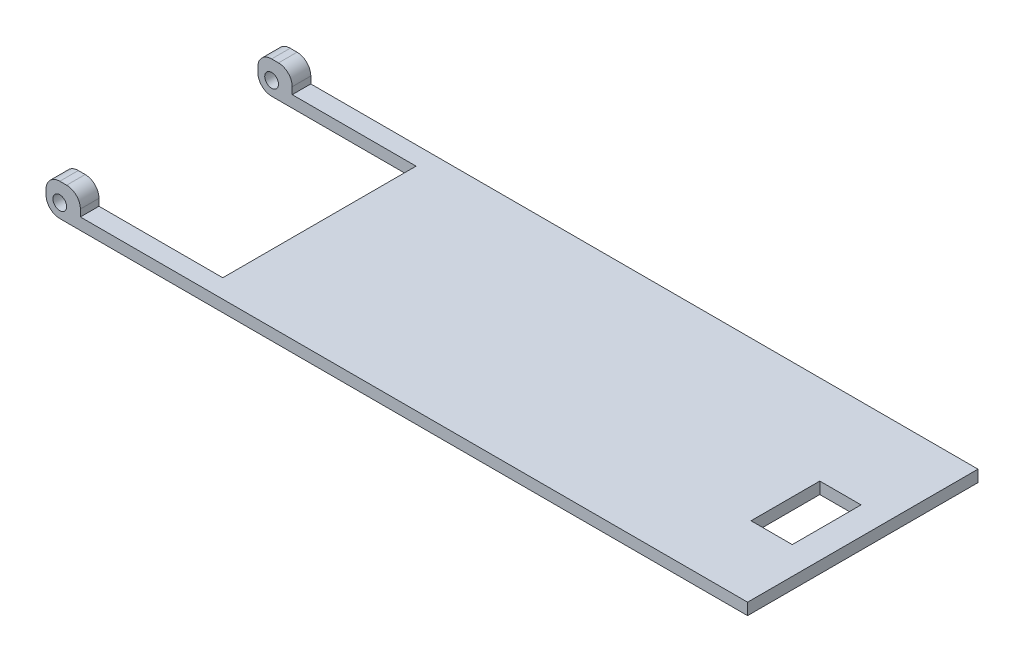
ISO-10303-21;
HEADER;
FILE_DESCRIPTION(('STEP AP214'),'2;1');
FILE_NAME('part.step','',(''),(''),'','','');
FILE_SCHEMA(('AUTOMOTIVE_DESIGN { 1 0 10303 214 1 1 1 1 }'));
ENDSEC;
DATA;
#1=APPLICATION_CONTEXT('core data for automotive mechanical design processes');
#2=APPLICATION_PROTOCOL_DEFINITION('international standard','automotive_design',2000,#1);
#3=PRODUCT_CONTEXT('',#1,'mechanical');
#4=PRODUCT('Part','Part','',(#3));
#5=PRODUCT_RELATED_PRODUCT_CATEGORY('part','',(#4));
#6=PRODUCT_DEFINITION_FORMATION('','',#4);
#7=PRODUCT_DEFINITION_CONTEXT('part definition',#1,'design');
#8=PRODUCT_DEFINITION('design','',#6,#7);
#9=PRODUCT_DEFINITION_SHAPE('','',#8);
#10=(LENGTH_UNIT() NAMED_UNIT(*) SI_UNIT(.MILLI.,.METRE.));
#11=(NAMED_UNIT(*) PLANE_ANGLE_UNIT() SI_UNIT($,.RADIAN.));
#12=(NAMED_UNIT(*) SI_UNIT($,.STERADIAN.) SOLID_ANGLE_UNIT());
#13=UNCERTAINTY_MEASURE_WITH_UNIT(LENGTH_MEASURE(1.E-05),#10,'distance_accuracy_value','');
#14=(GEOMETRIC_REPRESENTATION_CONTEXT(3) GLOBAL_UNCERTAINTY_ASSIGNED_CONTEXT((#13)) GLOBAL_UNIT_ASSIGNED_CONTEXT((#10,
#11,#12)) REPRESENTATION_CONTEXT('',''));
#15=CARTESIAN_POINT('',(0.,0.,0.));
#16=DIRECTION('',(0.,0.,1.));
#17=DIRECTION('',(1.,0.,0.));
#18=AXIS2_PLACEMENT_3D('',#15,#16,#17);
#19=CARTESIAN_POINT('',(0.,1.7,0.));
#20=DIRECTION('',(0.,-1.,0.));
#21=DIRECTION('',(0.,0.,-1.));
#22=AXIS2_PLACEMENT_3D('',#19,#20,#21);
#23=PLANE('',#22);
#24=DIRECTION('',(-1.,0.,0.));
#25=VECTOR('',#24,1.);
#26=CARTESIAN_POINT('',(41.,1.7,-3.75));
#27=LINE('',#26,#25);
#28=CARTESIAN_POINT('',(47.,1.7,-3.75));
#29=VERTEX_POINT('',#28);
#30=CARTESIAN_POINT('',(41.,1.7,-3.75));
#31=VERTEX_POINT('',#30);
#32=EDGE_CURVE('E228',#29,#31,#27,.T.);
#33=ORIENTED_EDGE('',*,*,#32,.F.);
#34=DIRECTION('',(0.,0.,-1.));
#35=VECTOR('',#34,1.);
#36=CARTESIAN_POINT('',(47.,1.7,6.25));
#37=LINE('',#36,#35);
#38=CARTESIAN_POINT('',(47.,1.7,6.25));
#39=VERTEX_POINT('',#38);
#40=EDGE_CURVE('E61',#39,#29,#37,.T.);
#41=ORIENTED_EDGE('',*,*,#40,.F.);
#42=DIRECTION('',(1.,0.,0.));
#43=VECTOR('',#42,1.);
#44=CARTESIAN_POINT('',(41.,1.7,6.25));
#45=LINE('',#44,#43);
#46=CARTESIAN_POINT('',(41.,1.7,6.25));
#47=VERTEX_POINT('',#46);
#48=EDGE_CURVE('E215',#47,#39,#45,.T.);
#49=ORIENTED_EDGE('',*,*,#48,.F.);
#50=DIRECTION('',(0.,0.,1.));
#51=VECTOR('',#50,1.);
#52=CARTESIAN_POINT('',(41.,1.7,6.25));
#53=LINE('',#52,#51);
#54=EDGE_CURVE('E219',#31,#47,#53,.T.);
#55=ORIENTED_EDGE('',*,*,#54,.F.);
#56=EDGE_LOOP('',(#33,#41,#49,#55));
#57=FACE_BOUND('',#56,.T.);
#58=DIRECTION('',(-1.,0.,0.));
#59=VECTOR('',#58,1.);
#60=CARTESIAN_POINT('',(-51.,1.7,-16.75));
#61=LINE('',#60,#59);
#62=CARTESIAN_POINT('',(51.,1.7,-16.75));
#63=VERTEX_POINT('',#62);
#64=CARTESIAN_POINT('',(-46.,1.7,-16.75));
#65=VERTEX_POINT('',#64);
#66=EDGE_CURVE('E336',#63,#65,#61,.T.);
#67=ORIENTED_EDGE('',*,*,#66,.T.);
#68=DIRECTION('',(0.,0.,1.));
#69=VECTOR('',#68,1.);
#70=CARTESIAN_POINT('',(-46.,1.7,-14.05));
#71=LINE('',#70,#69);
#72=CARTESIAN_POINT('',(-46.,1.7,-14.05));
#73=VERTEX_POINT('',#72);
#74=EDGE_CURVE('E247',#65,#73,#71,.T.);
#75=ORIENTED_EDGE('',*,*,#74,.T.);
#76=DIRECTION('',(-1.,0.,0.));
#77=VECTOR('',#76,1.);
#78=CARTESIAN_POINT('',(-51.,1.7,-14.05));
#79=LINE('',#78,#77);
#80=CARTESIAN_POINT('',(-28.,1.7,-14.05));
#81=VERTEX_POINT('',#80);
#82=EDGE_CURVE('E299',#81,#73,#79,.T.);
#83=ORIENTED_EDGE('',*,*,#82,.F.);
#84=DIRECTION('',(0.,0.,-1.));
#85=VECTOR('',#84,1.);
#86=CARTESIAN_POINT('',(-28.,1.7,14.05));
#87=LINE('',#86,#85);
#88=CARTESIAN_POINT('',(-28.,1.7,14.05));
#89=VERTEX_POINT('',#88);
#90=EDGE_CURVE('E310',#89,#81,#87,.T.);
#91=ORIENTED_EDGE('',*,*,#90,.F.);
#92=DIRECTION('',(1.,0.,0.));
#93=VECTOR('',#92,1.);
#94=CARTESIAN_POINT('',(-51.,1.7,14.05));
#95=LINE('',#94,#93);
#96=CARTESIAN_POINT('',(-46.,1.7,14.05));
#97=VERTEX_POINT('',#96);
#98=EDGE_CURVE('E294',#97,#89,#95,.T.);
#99=ORIENTED_EDGE('',*,*,#98,.F.);
#100=DIRECTION('',(0.,0.,-1.));
#101=VECTOR('',#100,1.);
#102=CARTESIAN_POINT('',(-46.,1.7,14.05));
#103=LINE('',#102,#101);
#104=CARTESIAN_POINT('',(-46.,1.7,16.75));
#105=VERTEX_POINT('',#104);
#106=EDGE_CURVE('E273',#105,#97,#103,.T.);
#107=ORIENTED_EDGE('',*,*,#106,.F.);
#108=DIRECTION('',(1.,0.,0.));
#109=VECTOR('',#108,1.);
#110=CARTESIAN_POINT('',(-51.,1.7,16.75));
#111=LINE('',#110,#109);
#112=CARTESIAN_POINT('',(51.,1.7,16.75));
#113=VERTEX_POINT('',#112);
#114=EDGE_CURVE('E341',#105,#113,#111,.T.);
#115=ORIENTED_EDGE('',*,*,#114,.T.);
#116=DIRECTION('',(0.,0.,-1.));
#117=VECTOR('',#116,1.);
#118=CARTESIAN_POINT('',(51.,1.7,16.75));
#119=LINE('',#118,#117);
#120=EDGE_CURVE('E332',#113,#63,#119,.T.);
#121=ORIENTED_EDGE('',*,*,#120,.T.);
#122=EDGE_LOOP('',(#67,#75,#83,#91,#99,#107,#115,#121));
#123=FACE_BOUND('',#122,.T.);
#124=ADVANCED_FACE('F45',(#57,#123),#23,.F.);
#125=CARTESIAN_POINT('',(-51.,1.7,16.75));
#126=DIRECTION('',(1.,0.,0.));
#127=DIRECTION('',(0.,0.,-1.));
#128=AXIS2_PLACEMENT_3D('',#125,#126,#127);
#129=PLANE('',#128);
#130=DIRECTION('',(0.,-1.,0.));
#131=VECTOR('',#130,1.);
#132=CARTESIAN_POINT('',(-51.,1.7,-16.75));
#133=LINE('',#132,#131);
#134=CARTESIAN_POINT('',(-51.,2.7,-16.75));
#135=VERTEX_POINT('',#134);
#136=CARTESIAN_POINT('',(-51.,2.,-16.75));
#137=VERTEX_POINT('',#136);
#138=EDGE_CURVE('E361',#135,#137,#133,.T.);
#139=ORIENTED_EDGE('',*,*,#138,.T.);
#140=DIRECTION('',(0.,0.,1.));
#141=VECTOR('',#140,1.);
#142=CARTESIAN_POINT('',(-51.,2.,-14.05));
#143=LINE('',#142,#141);
#144=CARTESIAN_POINT('',(-51.,2.,-14.05));
#145=VERTEX_POINT('',#144);
#146=EDGE_CURVE('E412',#137,#145,#143,.T.);
#147=ORIENTED_EDGE('',*,*,#146,.T.);
#148=DIRECTION('',(0.,1.,0.));
#149=VECTOR('',#148,1.);
#150=CARTESIAN_POINT('',(-51.,0.,-14.05));
#151=LINE('',#150,#149);
#152=CARTESIAN_POINT('',(-51.,2.7,-14.05));
#153=VERTEX_POINT('',#152);
#154=EDGE_CURVE('E317',#145,#153,#151,.T.);
#155=ORIENTED_EDGE('',*,*,#154,.T.);
#156=DIRECTION('',(0.,0.,-1.));
#157=VECTOR('',#156,1.);
#158=CARTESIAN_POINT('',(-51.,2.7,-16.75));
#159=LINE('',#158,#157);
#160=EDGE_CURVE('E408',#153,#135,#159,.T.);
#161=ORIENTED_EDGE('',*,*,#160,.T.);
#162=EDGE_LOOP('',(#139,#147,#155,#161));
#163=FACE_BOUND('',#162,.T.);
#164=ADVANCED_FACE('F456',(#163),#129,.F.);
#165=CARTESIAN_POINT('',(51.,1.7,16.75));
#166=DIRECTION('',(-1.,0.,0.));
#167=DIRECTION('',(0.,0.,1.));
#168=AXIS2_PLACEMENT_3D('',#165,#166,#167);
#169=PLANE('',#168);
#170=DIRECTION('',(0.,0.,-1.));
#171=VECTOR('',#170,1.);
#172=CARTESIAN_POINT('',(51.,0.,16.75));
#173=LINE('',#172,#171);
#174=CARTESIAN_POINT('',(51.,0.,16.75));
#175=VERTEX_POINT('',#174);
#176=CARTESIAN_POINT('',(51.,0.,-16.75));
#177=VERTEX_POINT('',#176);
#178=EDGE_CURVE('E321',#175,#177,#173,.T.);
#179=ORIENTED_EDGE('',*,*,#178,.T.);
#180=DIRECTION('',(0.,-1.,0.));
#181=VECTOR('',#180,1.);
#182=CARTESIAN_POINT('',(51.,1.7,-16.75));
#183=LINE('',#182,#181);
#184=EDGE_CURVE('E365',#63,#177,#183,.T.);
#185=ORIENTED_EDGE('',*,*,#184,.F.);
#186=ORIENTED_EDGE('',*,*,#120,.F.);
#187=DIRECTION('',(0.,-1.,0.));
#188=VECTOR('',#187,1.);
#189=CARTESIAN_POINT('',(51.,1.7,16.75));
#190=LINE('',#189,#188);
#191=EDGE_CURVE('E344',#113,#175,#190,.T.);
#192=ORIENTED_EDGE('',*,*,#191,.T.);
#193=EDGE_LOOP('',(#179,#185,#186,#192));
#194=FACE_BOUND('',#193,.T.);
#195=ADVANCED_FACE('F512',(#194),#169,.F.);
#196=CARTESIAN_POINT('',(-51.,1.7,-16.75));
#197=DIRECTION('',(0.,0.,1.));
#198=DIRECTION('',(1.,0.,0.));
#199=AXIS2_PLACEMENT_3D('',#196,#197,#198);
#200=PLANE('',#199);
#201=CARTESIAN_POINT('',(-49.,2.,-16.75));
#202=DIRECTION('',(0.,0.,1.));
#203=DIRECTION('',(1.,0.,0.));
#204=AXIS2_PLACEMENT_3D('',#201,#202,#203);
#205=CIRCLE('',#204,0.999999999999998);
#206=CARTESIAN_POINT('',(-50.,2.,-16.75));
#207=VERTEX_POINT('',#206);
#208=EDGE_CURVE('E237',#207,#207,#205,.T.);
#209=ORIENTED_EDGE('',*,*,#208,.T.);
#210=EDGE_LOOP('',(#209));
#211=FACE_BOUND('',#210,.T.);
#212=DIRECTION('',(-1.,0.,0.));
#213=VECTOR('',#212,1.);
#214=CARTESIAN_POINT('',(-51.,0.,-16.75));
#215=LINE('',#214,#213);
#216=CARTESIAN_POINT('',(-49.,0.,-16.75));
#217=VERTEX_POINT('',#216);
#218=EDGE_CURVE('E348',#177,#217,#215,.T.);
#219=ORIENTED_EDGE('',*,*,#218,.T.);
#220=CARTESIAN_POINT('',(-49.,2.,-16.75));
#221=DIRECTION('',(0.,0.,1.));
#222=DIRECTION('',(1.,0.,0.));
#223=AXIS2_PLACEMENT_3D('',#220,#221,#222);
#224=CIRCLE('',#223,2.);
#225=EDGE_CURVE('E434',#217,#137,#224,.F.);
#226=ORIENTED_EDGE('',*,*,#225,.T.);
#227=ORIENTED_EDGE('',*,*,#138,.F.);
#228=CARTESIAN_POINT('',(-49.,2.7,-16.75));
#229=DIRECTION('',(0.,0.,1.));
#230=DIRECTION('',(1.,0.,0.));
#231=AXIS2_PLACEMENT_3D('',#228,#229,#230);
#232=CIRCLE('',#231,2.);
#233=CARTESIAN_POINT('',(-49.,4.7,-16.75));
#234=VERTEX_POINT('',#233);
#235=EDGE_CURVE('E428',#135,#234,#232,.F.);
#236=ORIENTED_EDGE('',*,*,#235,.T.);
#237=DIRECTION('',(1.,0.,0.));
#238=VECTOR('',#237,1.);
#239=CARTESIAN_POINT('',(-51.,4.7,-16.75));
#240=LINE('',#239,#238);
#241=CARTESIAN_POINT('',(-48.,4.7,-16.75));
#242=VERTEX_POINT('',#241);
#243=EDGE_CURVE('E255',#234,#242,#240,.T.);
#244=ORIENTED_EDGE('',*,*,#243,.T.);
#245=CARTESIAN_POINT('',(-48.,2.7,-16.75));
#246=DIRECTION('',(0.,0.,1.));
#247=DIRECTION('',(1.,0.,0.));
#248=AXIS2_PLACEMENT_3D('',#245,#246,#247);
#249=CIRCLE('',#248,2.);
#250=CARTESIAN_POINT('',(-46.,2.7,-16.75));
#251=VERTEX_POINT('',#250);
#252=EDGE_CURVE('E431',#242,#251,#249,.F.);
#253=ORIENTED_EDGE('',*,*,#252,.T.);
#254=DIRECTION('',(0.,-1.,0.));
#255=VECTOR('',#254,1.);
#256=CARTESIAN_POINT('',(-46.,4.7,-16.75));
#257=LINE('',#256,#255);
#258=EDGE_CURVE('E259',#251,#65,#257,.T.);
#259=ORIENTED_EDGE('',*,*,#258,.T.);
#260=ORIENTED_EDGE('',*,*,#66,.F.);
#261=ORIENTED_EDGE('',*,*,#184,.T.);
#262=EDGE_LOOP('',(#219,#226,#227,#236,#244,#253,#259,#260,#261));
#263=FACE_BOUND('',#262,.T.);
#264=ADVANCED_FACE('F459',(#211,#263),#200,.F.);
#265=DIRECTION('',(0.,1.,0.));
#266=VECTOR('',#265,1.);
#267=CARTESIAN_POINT('',(-51.,0.,14.05));
#268=LINE('',#267,#266);
#269=CARTESIAN_POINT('',(-51.,2.,14.05));
#270=VERTEX_POINT('',#269);
#271=CARTESIAN_POINT('',(-51.,2.7,14.05));
#272=VERTEX_POINT('',#271);
#273=EDGE_CURVE('E307',#270,#272,#268,.T.);
#274=ORIENTED_EDGE('',*,*,#273,.F.);
#275=DIRECTION('',(0.,0.,1.));
#276=VECTOR('',#275,1.);
#277=CARTESIAN_POINT('',(-51.,2.,16.75));
#278=LINE('',#277,#276);
#279=CARTESIAN_POINT('',(-51.,2.,16.75));
#280=VERTEX_POINT('',#279);
#281=EDGE_CURVE('E372',#270,#280,#278,.T.);
#282=ORIENTED_EDGE('',*,*,#281,.T.);
#283=DIRECTION('',(0.,-1.,0.));
#284=VECTOR('',#283,1.);
#285=CARTESIAN_POINT('',(-51.,1.7,16.75));
#286=LINE('',#285,#284);
#287=CARTESIAN_POINT('',(-51.,2.7,16.75));
#288=VERTEX_POINT('',#287);
#289=EDGE_CURVE('E357',#288,#280,#286,.T.);
#290=ORIENTED_EDGE('',*,*,#289,.F.);
#291=DIRECTION('',(0.,0.,1.));
#292=VECTOR('',#291,1.);
#293=CARTESIAN_POINT('',(-51.,2.7,14.05));
#294=LINE('',#293,#292);
#295=EDGE_CURVE('E369',#288,#272,#294,.F.);
#296=ORIENTED_EDGE('',*,*,#295,.T.);
#297=EDGE_LOOP('',(#274,#282,#290,#296));
#298=FACE_BOUND('',#297,.T.);
#299=ADVANCED_FACE('F503',(#298),#129,.F.);
#300=CARTESIAN_POINT('',(-51.,1.7,16.75));
#301=DIRECTION('',(0.,0.,-1.));
#302=DIRECTION('',(-1.,0.,0.));
#303=AXIS2_PLACEMENT_3D('',#300,#301,#302);
#304=PLANE('',#303);
#305=CARTESIAN_POINT('',(-49.,2.,16.75));
#306=DIRECTION('',(0.,0.,1.));
#307=DIRECTION('',(1.,0.,0.));
#308=AXIS2_PLACEMENT_3D('',#305,#306,#307);
#309=CIRCLE('',#308,0.999999999999998);
#310=CARTESIAN_POINT('',(-48.,2.,16.75));
#311=VERTEX_POINT('',#310);
#312=EDGE_CURVE('E268',#311,#311,#309,.T.);
#313=ORIENTED_EDGE('',*,*,#312,.F.);
#314=EDGE_LOOP('',(#313));
#315=FACE_BOUND('',#314,.T.);
#316=ORIENTED_EDGE('',*,*,#289,.T.);
#317=CARTESIAN_POINT('',(-49.,2.,16.75));
#318=DIRECTION('',(0.,0.,-1.));
#319=DIRECTION('',(-1.,0.,0.));
#320=AXIS2_PLACEMENT_3D('',#317,#318,#319);
#321=CIRCLE('',#320,2.);
#322=CARTESIAN_POINT('',(-49.,0.,16.75));
#323=VERTEX_POINT('',#322);
#324=EDGE_CURVE('E382',#280,#323,#321,.F.);
#325=ORIENTED_EDGE('',*,*,#324,.T.);
#326=DIRECTION('',(1.,0.,0.));
#327=VECTOR('',#326,1.);
#328=CARTESIAN_POINT('',(-51.,0.,16.75));
#329=LINE('',#328,#327);
#330=EDGE_CURVE('E337',#323,#175,#329,.T.);
#331=ORIENTED_EDGE('',*,*,#330,.T.);
#332=ORIENTED_EDGE('',*,*,#191,.F.);
#333=ORIENTED_EDGE('',*,*,#114,.F.);
#334=DIRECTION('',(0.,-1.,0.));
#335=VECTOR('',#334,1.);
#336=CARTESIAN_POINT('',(-46.,4.7,16.75));
#337=LINE('',#336,#335);
#338=CARTESIAN_POINT('',(-46.,2.7,16.75));
#339=VERTEX_POINT('',#338);
#340=EDGE_CURVE('E291',#339,#105,#337,.T.);
#341=ORIENTED_EDGE('',*,*,#340,.F.);
#342=CARTESIAN_POINT('',(-48.,2.7,16.75));
#343=DIRECTION('',(0.,0.,-1.));
#344=DIRECTION('',(-1.,0.,0.));
#345=AXIS2_PLACEMENT_3D('',#342,#343,#344);
#346=CIRCLE('',#345,2.);
#347=CARTESIAN_POINT('',(-48.,4.7,16.75));
#348=VERTEX_POINT('',#347);
#349=EDGE_CURVE('E379',#339,#348,#346,.F.);
#350=ORIENTED_EDGE('',*,*,#349,.T.);
#351=DIRECTION('',(1.,0.,0.));
#352=VECTOR('',#351,1.);
#353=CARTESIAN_POINT('',(-51.,4.7,16.75));
#354=LINE('',#353,#352);
#355=CARTESIAN_POINT('',(-49.,4.7,16.75));
#356=VERTEX_POINT('',#355);
#357=EDGE_CURVE('E277',#356,#348,#354,.T.);
#358=ORIENTED_EDGE('',*,*,#357,.F.);
#359=CARTESIAN_POINT('',(-49.,2.7,16.75));
#360=DIRECTION('',(0.,0.,-1.));
#361=DIRECTION('',(-1.,0.,0.));
#362=AXIS2_PLACEMENT_3D('',#359,#360,#361);
#363=CIRCLE('',#362,2.);
#364=EDGE_CURVE('E376',#356,#288,#363,.F.);
#365=ORIENTED_EDGE('',*,*,#364,.T.);
#366=EDGE_LOOP('',(#316,#325,#331,#332,#333,#341,#350,#358,#365));
#367=FACE_BOUND('',#366,.T.);
#368=ADVANCED_FACE('F486',(#315,#367),#304,.F.);
#369=CARTESIAN_POINT('',(0.,0.,0.));
#370=DIRECTION('',(0.,-1.,0.));
#371=DIRECTION('',(0.,0.,-1.));
#372=AXIS2_PLACEMENT_3D('',#369,#370,#371);
#373=PLANE('',#372);
#374=DIRECTION('',(0.,0.,-1.));
#375=VECTOR('',#374,1.);
#376=CARTESIAN_POINT('',(47.,0.,6.25));
#377=LINE('',#376,#375);
#378=CARTESIAN_POINT('',(47.,0.,6.25));
#379=VERTEX_POINT('',#378);
#380=CARTESIAN_POINT('',(47.,0.,-3.75));
#381=VERTEX_POINT('',#380);
#382=EDGE_CURVE('E196',#379,#381,#377,.T.);
#383=ORIENTED_EDGE('',*,*,#382,.T.);
#384=DIRECTION('',(-1.,0.,0.));
#385=VECTOR('',#384,1.);
#386=CARTESIAN_POINT('',(41.,0.,-3.75));
#387=LINE('',#386,#385);
#388=CARTESIAN_POINT('',(41.,0.,-3.75));
#389=VERTEX_POINT('',#388);
#390=EDGE_CURVE('E206',#381,#389,#387,.T.);
#391=ORIENTED_EDGE('',*,*,#390,.T.);
#392=DIRECTION('',(0.,0.,1.));
#393=VECTOR('',#392,1.);
#394=CARTESIAN_POINT('',(41.,0.,6.25));
#395=LINE('',#394,#393);
#396=CARTESIAN_POINT('',(41.,0.,6.25));
#397=VERTEX_POINT('',#396);
#398=EDGE_CURVE('E69',#389,#397,#395,.T.);
#399=ORIENTED_EDGE('',*,*,#398,.T.);
#400=DIRECTION('',(1.,0.,0.));
#401=VECTOR('',#400,1.);
#402=CARTESIAN_POINT('',(41.,0.,6.25));
#403=LINE('',#402,#401);
#404=EDGE_CURVE('E203',#397,#379,#403,.T.);
#405=ORIENTED_EDGE('',*,*,#404,.T.);
#406=EDGE_LOOP('',(#383,#391,#399,#405));
#407=FACE_BOUND('',#406,.T.);
#408=DIRECTION('',(-1.,0.,0.));
#409=VECTOR('',#408,1.);
#410=CARTESIAN_POINT('',(-51.,0.,-14.05));
#411=LINE('',#410,#409);
#412=CARTESIAN_POINT('',(-28.,0.,-14.05));
#413=VERTEX_POINT('',#412);
#414=CARTESIAN_POINT('',(-49.,0.,-14.05));
#415=VERTEX_POINT('',#414);
#416=EDGE_CURVE('E303',#413,#415,#411,.T.);
#417=ORIENTED_EDGE('',*,*,#416,.T.);
#418=DIRECTION('',(0.,0.,1.));
#419=VECTOR('',#418,1.);
#420=CARTESIAN_POINT('',(-49.,0.,-16.75));
#421=LINE('',#420,#419);
#422=EDGE_CURVE('E425',#415,#217,#421,.F.);
#423=ORIENTED_EDGE('',*,*,#422,.T.);
#424=ORIENTED_EDGE('',*,*,#218,.F.);
#425=ORIENTED_EDGE('',*,*,#178,.F.);
#426=ORIENTED_EDGE('',*,*,#330,.F.);
#427=DIRECTION('',(0.,0.,1.));
#428=VECTOR('',#427,1.);
#429=CARTESIAN_POINT('',(-49.,0.,14.05));
#430=LINE('',#429,#428);
#431=CARTESIAN_POINT('',(-49.,0.,14.05));
#432=VERTEX_POINT('',#431);
#433=EDGE_CURVE('E385',#323,#432,#430,.F.);
#434=ORIENTED_EDGE('',*,*,#433,.T.);
#435=DIRECTION('',(1.,0.,0.));
#436=VECTOR('',#435,1.);
#437=CARTESIAN_POINT('',(-51.,0.,14.05));
#438=LINE('',#437,#436);
#439=CARTESIAN_POINT('',(-28.,0.,14.05));
#440=VERTEX_POINT('',#439);
#441=EDGE_CURVE('E295',#432,#440,#438,.T.);
#442=ORIENTED_EDGE('',*,*,#441,.T.);
#443=DIRECTION('',(0.,0.,-1.));
#444=VECTOR('',#443,1.);
#445=CARTESIAN_POINT('',(-28.,0.,14.05));
#446=LINE('',#445,#444);
#447=EDGE_CURVE('E298',#440,#413,#446,.T.);
#448=ORIENTED_EDGE('',*,*,#447,.T.);
#449=EDGE_LOOP('',(#417,#423,#424,#425,#426,#434,#442,#448));
#450=FACE_BOUND('',#449,.T.);
#451=ADVANCED_FACE('F211',(#407,#450),#373,.T.);
#452=CARTESIAN_POINT('',(-51.,0.,-14.05));
#453=DIRECTION('',(0.,0.,-1.));
#454=DIRECTION('',(-1.,0.,0.));
#455=AXIS2_PLACEMENT_3D('',#452,#453,#454);
#456=PLANE('',#455);
#457=CARTESIAN_POINT('',(-49.,2.,-14.05));
#458=DIRECTION('',(0.,0.,1.));
#459=DIRECTION('',(1.,0.,0.));
#460=AXIS2_PLACEMENT_3D('',#457,#458,#459);
#461=CIRCLE('',#460,0.999999999999998);
#462=CARTESIAN_POINT('',(-50.,2.,-14.05));
#463=VERTEX_POINT('',#462);
#464=EDGE_CURVE('E243',#463,#463,#461,.T.);
#465=ORIENTED_EDGE('',*,*,#464,.F.);
#466=EDGE_LOOP('',(#465));
#467=FACE_BOUND('',#466,.T.);
#468=ORIENTED_EDGE('',*,*,#154,.F.);
#469=CARTESIAN_POINT('',(-49.,2.,-14.05));
#470=DIRECTION('',(0.,0.,-1.));
#471=DIRECTION('',(-1.,0.,0.));
#472=AXIS2_PLACEMENT_3D('',#469,#470,#471);
#473=CIRCLE('',#472,2.);
#474=EDGE_CURVE('E422',#145,#415,#473,.F.);
#475=ORIENTED_EDGE('',*,*,#474,.T.);
#476=ORIENTED_EDGE('',*,*,#416,.F.);
#477=DIRECTION('',(0.,1.,0.));
#478=VECTOR('',#477,1.);
#479=CARTESIAN_POINT('',(-28.,0.,-14.05));
#480=LINE('',#479,#478);
#481=EDGE_CURVE('E322',#413,#81,#480,.T.);
#482=ORIENTED_EDGE('',*,*,#481,.T.);
#483=ORIENTED_EDGE('',*,*,#82,.T.);
#484=DIRECTION('',(0.,-1.,0.));
#485=VECTOR('',#484,1.);
#486=CARTESIAN_POINT('',(-46.,4.7,-14.05));
#487=LINE('',#486,#485);
#488=CARTESIAN_POINT('',(-46.,2.7,-14.05));
#489=VERTEX_POINT('',#488);
#490=EDGE_CURVE('E265',#489,#73,#487,.T.);
#491=ORIENTED_EDGE('',*,*,#490,.F.);
#492=CARTESIAN_POINT('',(-48.,2.7,-14.05));
#493=DIRECTION('',(0.,0.,-1.));
#494=DIRECTION('',(-1.,0.,0.));
#495=AXIS2_PLACEMENT_3D('',#492,#493,#494);
#496=CIRCLE('',#495,2.);
#497=CARTESIAN_POINT('',(-48.,4.7,-14.05));
#498=VERTEX_POINT('',#497);
#499=EDGE_CURVE('E419',#489,#498,#496,.F.);
#500=ORIENTED_EDGE('',*,*,#499,.T.);
#501=DIRECTION('',(-1.,0.,0.));
#502=VECTOR('',#501,1.);
#503=CARTESIAN_POINT('',(-51.,4.7,-14.05));
#504=LINE('',#503,#502);
#505=CARTESIAN_POINT('',(-49.,4.7,-14.05));
#506=VERTEX_POINT('',#505);
#507=EDGE_CURVE('E251',#498,#506,#504,.T.);
#508=ORIENTED_EDGE('',*,*,#507,.T.);
#509=CARTESIAN_POINT('',(-49.,2.7,-14.05));
#510=DIRECTION('',(0.,0.,-1.));
#511=DIRECTION('',(-1.,0.,0.));
#512=AXIS2_PLACEMENT_3D('',#509,#510,#511);
#513=CIRCLE('',#512,2.);
#514=EDGE_CURVE('E416',#506,#153,#513,.F.);
#515=ORIENTED_EDGE('',*,*,#514,.T.);
#516=EDGE_LOOP('',(#468,#475,#476,#482,#483,#491,#500,#508,#515));
#517=FACE_BOUND('',#516,.T.);
#518=ADVANCED_FACE('F451',(#467,#517),#456,.F.);
#519=CARTESIAN_POINT('',(-28.,0.,14.05));
#520=DIRECTION('',(1.,0.,0.));
#521=DIRECTION('',(0.,0.,-1.));
#522=AXIS2_PLACEMENT_3D('',#519,#520,#521);
#523=PLANE('',#522);
#524=ORIENTED_EDGE('',*,*,#90,.T.);
#525=ORIENTED_EDGE('',*,*,#481,.F.);
#526=ORIENTED_EDGE('',*,*,#447,.F.);
#527=DIRECTION('',(0.,1.,0.));
#528=VECTOR('',#527,1.);
#529=CARTESIAN_POINT('',(-28.,0.,14.05));
#530=LINE('',#529,#528);
#531=EDGE_CURVE('E325',#440,#89,#530,.T.);
#532=ORIENTED_EDGE('',*,*,#531,.T.);
#533=EDGE_LOOP('',(#524,#525,#526,#532));
#534=FACE_BOUND('',#533,.T.);
#535=ADVANCED_FACE('F469',(#534),#523,.F.);
#536=CARTESIAN_POINT('',(-51.,0.,14.05));
#537=DIRECTION('',(0.,0.,1.));
#538=DIRECTION('',(1.,0.,0.));
#539=AXIS2_PLACEMENT_3D('',#536,#537,#538);
#540=PLANE('',#539);
#541=CARTESIAN_POINT('',(-49.,2.,14.05));
#542=DIRECTION('',(0.,0.,1.));
#543=DIRECTION('',(1.,0.,0.));
#544=AXIS2_PLACEMENT_3D('',#541,#542,#543);
#545=CIRCLE('',#544,0.999999999999998);
#546=CARTESIAN_POINT('',(-48.,2.,14.05));
#547=VERTEX_POINT('',#546);
#548=EDGE_CURVE('E269',#547,#547,#545,.T.);
#549=ORIENTED_EDGE('',*,*,#548,.T.);
#550=EDGE_LOOP('',(#549));
#551=FACE_BOUND('',#550,.T.);
#552=ORIENTED_EDGE('',*,*,#441,.F.);
#553=CARTESIAN_POINT('',(-49.,2.,14.05));
#554=DIRECTION('',(0.,0.,1.));
#555=DIRECTION('',(1.,0.,0.));
#556=AXIS2_PLACEMENT_3D('',#553,#554,#555);
#557=CIRCLE('',#556,2.);
#558=EDGE_CURVE('E394',#432,#270,#557,.F.);
#559=ORIENTED_EDGE('',*,*,#558,.T.);
#560=ORIENTED_EDGE('',*,*,#273,.T.);
#561=CARTESIAN_POINT('',(-49.,2.7,14.05));
#562=DIRECTION('',(0.,0.,1.));
#563=DIRECTION('',(1.,0.,0.));
#564=AXIS2_PLACEMENT_3D('',#561,#562,#563);
#565=CIRCLE('',#564,2.);
#566=CARTESIAN_POINT('',(-49.,4.7,14.05));
#567=VERTEX_POINT('',#566);
#568=EDGE_CURVE('E388',#272,#567,#565,.F.);
#569=ORIENTED_EDGE('',*,*,#568,.T.);
#570=DIRECTION('',(-1.,0.,0.));
#571=VECTOR('',#570,1.);
#572=CARTESIAN_POINT('',(-51.,4.7,14.05));
#573=LINE('',#572,#571);
#574=CARTESIAN_POINT('',(-48.,4.7,14.05));
#575=VERTEX_POINT('',#574);
#576=EDGE_CURVE('E281',#575,#567,#573,.T.);
#577=ORIENTED_EDGE('',*,*,#576,.F.);
#578=CARTESIAN_POINT('',(-48.,2.7,14.05));
#579=DIRECTION('',(0.,0.,1.));
#580=DIRECTION('',(1.,0.,0.));
#581=AXIS2_PLACEMENT_3D('',#578,#579,#580);
#582=CIRCLE('',#581,2.);
#583=CARTESIAN_POINT('',(-46.,2.7,14.05));
#584=VERTEX_POINT('',#583);
#585=EDGE_CURVE('E391',#575,#584,#582,.F.);
#586=ORIENTED_EDGE('',*,*,#585,.T.);
#587=DIRECTION('',(0.,-1.,0.));
#588=VECTOR('',#587,1.);
#589=CARTESIAN_POINT('',(-46.,4.7,14.05));
#590=LINE('',#589,#588);
#591=EDGE_CURVE('E285',#584,#97,#590,.T.);
#592=ORIENTED_EDGE('',*,*,#591,.T.);
#593=ORIENTED_EDGE('',*,*,#98,.T.);
#594=ORIENTED_EDGE('',*,*,#531,.F.);
#595=EDGE_LOOP('',(#552,#559,#560,#569,#577,#586,#592,#593,#594));
#596=FACE_BOUND('',#595,.T.);
#597=ADVANCED_FACE('F472',(#551,#596),#540,.F.);
#598=CARTESIAN_POINT('',(-46.,4.7,14.05));
#599=DIRECTION('',(-1.,0.,0.));
#600=DIRECTION('',(0.,0.,1.));
#601=AXIS2_PLACEMENT_3D('',#598,#599,#600);
#602=PLANE('',#601);
#603=ORIENTED_EDGE('',*,*,#591,.F.);
#604=DIRECTION('',(0.,0.,-1.));
#605=VECTOR('',#604,1.);
#606=CARTESIAN_POINT('',(-46.,2.7,16.75));
#607=LINE('',#606,#605);
#608=EDGE_CURVE('E405',#584,#339,#607,.F.);
#609=ORIENTED_EDGE('',*,*,#608,.T.);
#610=ORIENTED_EDGE('',*,*,#340,.T.);
#611=ORIENTED_EDGE('',*,*,#106,.T.);
#612=EDGE_LOOP('',(#603,#609,#610,#611));
#613=FACE_BOUND('',#612,.T.);
#614=ADVANCED_FACE('F481',(#613),#602,.F.);
#615=CARTESIAN_POINT('',(0.,4.7,0.));
#616=DIRECTION('',(0.,1.,0.));
#617=DIRECTION('',(0.,0.,1.));
#618=AXIS2_PLACEMENT_3D('',#615,#616,#617);
#619=PLANE('',#618);
#620=ORIENTED_EDGE('',*,*,#357,.T.);
#621=DIRECTION('',(0.,0.,-1.));
#622=VECTOR('',#621,1.);
#623=CARTESIAN_POINT('',(-48.,4.7,14.05));
#624=LINE('',#623,#622);
#625=EDGE_CURVE('E401',#348,#575,#624,.T.);
#626=ORIENTED_EDGE('',*,*,#625,.T.);
#627=ORIENTED_EDGE('',*,*,#576,.T.);
#628=DIRECTION('',(0.,0.,1.));
#629=VECTOR('',#628,1.);
#630=CARTESIAN_POINT('',(-49.,4.7,16.75));
#631=LINE('',#630,#629);
#632=EDGE_CURVE('E397',#567,#356,#631,.T.);
#633=ORIENTED_EDGE('',*,*,#632,.T.);
#634=EDGE_LOOP('',(#620,#626,#627,#633));
#635=FACE_BOUND('',#634,.T.);
#636=ADVANCED_FACE('F494',(#635),#619,.T.);
#637=CARTESIAN_POINT('',(-49.,2.,14.05));
#638=DIRECTION('',(0.,0.,1.));
#639=DIRECTION('',(1.,0.,0.));
#640=AXIS2_PLACEMENT_3D('',#637,#638,#639);
#641=CYLINDRICAL_SURFACE('',#640,0.999999999999998);
#642=CARTESIAN_POINT('',(-48.,2.,14.05));
#643=CARTESIAN_POINT('',(-48.,2.,14.078125));
#644=CARTESIAN_POINT('',(-48.,2.,14.10625));
#645=CARTESIAN_POINT('',(-48.,2.,14.1625));
#646=CARTESIAN_POINT('',(-48.,2.,14.190625));
#647=CARTESIAN_POINT('',(-48.,2.,14.246875));
#648=CARTESIAN_POINT('',(-48.,2.,14.275));
#649=CARTESIAN_POINT('',(-48.,2.,14.33125));
#650=CARTESIAN_POINT('',(-48.,2.,14.359375));
#651=CARTESIAN_POINT('',(-48.,2.,14.415625));
#652=CARTESIAN_POINT('',(-48.,2.,14.44375));
#653=CARTESIAN_POINT('',(-48.,2.,14.5));
#654=CARTESIAN_POINT('',(-48.,2.,14.528125));
#655=CARTESIAN_POINT('',(-48.,2.,14.584375));
#656=CARTESIAN_POINT('',(-48.,2.,14.6125));
#657=CARTESIAN_POINT('',(-48.,2.,14.66875));
#658=CARTESIAN_POINT('',(-48.,2.,14.696875));
#659=CARTESIAN_POINT('',(-48.,2.,14.753125));
#660=CARTESIAN_POINT('',(-48.,2.,14.78125));
#661=CARTESIAN_POINT('',(-48.,2.,14.8375));
#662=CARTESIAN_POINT('',(-48.,2.,14.865625));
#663=CARTESIAN_POINT('',(-48.,2.,14.921875));
#664=CARTESIAN_POINT('',(-48.,2.,14.95));
#665=CARTESIAN_POINT('',(-48.,2.,15.00625));
#666=CARTESIAN_POINT('',(-48.,2.,15.034375));
#667=CARTESIAN_POINT('',(-48.,2.,15.090625));
#668=CARTESIAN_POINT('',(-48.,2.,15.11875));
#669=CARTESIAN_POINT('',(-48.,2.,15.175));
#670=CARTESIAN_POINT('',(-48.,2.,15.203125));
#671=CARTESIAN_POINT('',(-48.,2.,15.259375));
#672=CARTESIAN_POINT('',(-48.,2.,15.2875));
#673=CARTESIAN_POINT('',(-48.,2.,15.34375));
#674=CARTESIAN_POINT('',(-48.,2.,15.371875));
#675=CARTESIAN_POINT('',(-48.,2.,15.428125));
#676=CARTESIAN_POINT('',(-48.,2.,15.45625));
#677=CARTESIAN_POINT('',(-48.,2.,15.5125));
#678=CARTESIAN_POINT('',(-48.,2.,15.540625));
#679=CARTESIAN_POINT('',(-48.,2.,15.596875));
#680=CARTESIAN_POINT('',(-48.,2.,15.625));
#681=CARTESIAN_POINT('',(-48.,2.,15.68125));
#682=CARTESIAN_POINT('',(-48.,2.,15.709375));
#683=CARTESIAN_POINT('',(-48.,2.,15.765625));
#684=CARTESIAN_POINT('',(-48.,2.,15.79375));
#685=CARTESIAN_POINT('',(-48.,2.,15.85));
#686=CARTESIAN_POINT('',(-48.,2.,15.878125));
#687=CARTESIAN_POINT('',(-48.,2.,15.934375));
#688=CARTESIAN_POINT('',(-48.,2.,15.9625));
#689=CARTESIAN_POINT('',(-48.,2.,16.01875));
#690=CARTESIAN_POINT('',(-48.,2.,16.046875));
#691=CARTESIAN_POINT('',(-48.,2.,16.103125));
#692=CARTESIAN_POINT('',(-48.,2.,16.13125));
#693=CARTESIAN_POINT('',(-48.,2.,16.1875));
#694=CARTESIAN_POINT('',(-48.,2.,16.215625));
#695=CARTESIAN_POINT('',(-48.,2.,16.271875));
#696=CARTESIAN_POINT('',(-48.,2.,16.3));
#697=CARTESIAN_POINT('',(-48.,2.,16.35625));
#698=CARTESIAN_POINT('',(-48.,2.,16.384375));
#699=CARTESIAN_POINT('',(-48.,2.,16.440625));
#700=CARTESIAN_POINT('',(-48.,2.,16.46875));
#701=CARTESIAN_POINT('',(-48.,2.,16.525));
#702=CARTESIAN_POINT('',(-48.,2.,16.553125));
#703=CARTESIAN_POINT('',(-48.,2.,16.609375));
#704=CARTESIAN_POINT('',(-48.,2.,16.6375));
#705=CARTESIAN_POINT('',(-48.,2.,16.69375));
#706=CARTESIAN_POINT('',(-48.,2.,16.721875));
#707=CARTESIAN_POINT('',(-48.,2.,16.75));
#708=B_SPLINE_CURVE_WITH_KNOTS('',3,(#642,#643,#644,#645,#646,#647,#648,#649,#650,#651,#652,
#653,#654,#655,#656,#657,#658,#659,#660,#661,#662,#663,#664,#665,#666,#667,#668,#669,#670,#671,
#672,#673,#674,#675,#676,#677,#678,#679,#680,#681,#682,#683,#684,#685,#686,#687,#688,#689,#690,
#691,#692,#693,#694,#695,#696,#697,#698,#699,#700,#701,#702,#703,#704,#705,#706,#707),
.UNSPECIFIED.,.F.,.F.,(4,2,2,2,2,2,2,2,2,2,2,2,2,2,2,2,2,2,2,2,2,2,2,2,2,2,2,2,2,2,2,2,4),(0.,
0.0843749999999994,0.168749999999999,0.253125,0.337499999999999,0.421874999999999,0.50625,
0.590624999999999,0.674999999999998,0.759375,0.843749999999999,0.928125,1.0125,1.096875,1.18125,
1.265625,1.35,1.434375,1.51875,1.603125,1.6875,1.771875,1.85625,1.940625,2.025,2.109375,2.19375,
2.278125,2.3625,2.446875,2.53125,2.615625,2.7),.UNSPECIFIED.);
#709=EDGE_CURVE('BSEAM552',#547,#311,#708,.T.);
#710=ORIENTED_EDGE('',*,*,#548,.F.);
#711=ORIENTED_EDGE('',*,*,#312,.T.);
#712=ORIENTED_EDGE('',*,*,#709,.T.);
#713=ORIENTED_EDGE('',*,*,#709,.F.);
#714=EDGE_LOOP('',(#710,#712,#711,#713));
#715=FACE_BOUND('',#714,.T.);
#716=ADVANCED_FACE('F552',(#715),#641,.F.);
#717=CARTESIAN_POINT('',(-49.,2.,16.75));
#718=DIRECTION('',(0.,0.,-1.));
#719=DIRECTION('',(-1.,0.,0.));
#720=AXIS2_PLACEMENT_3D('',#717,#718,#719);
#721=CYLINDRICAL_SURFACE('',#720,2.);
#722=ORIENTED_EDGE('',*,*,#558,.F.);
#723=ORIENTED_EDGE('',*,*,#433,.F.);
#724=ORIENTED_EDGE('',*,*,#324,.F.);
#725=ORIENTED_EDGE('',*,*,#281,.F.);
#726=EDGE_LOOP('',(#722,#723,#724,#725));
#727=FACE_BOUND('',#726,.T.);
#728=ADVANCED_FACE('F506',(#727),#721,.T.);
#729=CARTESIAN_POINT('',(-48.,2.7,0.));
#730=DIRECTION('',(0.,0.,1.));
#731=DIRECTION('',(1.,0.,0.));
#732=AXIS2_PLACEMENT_3D('',#729,#730,#731);
#733=CYLINDRICAL_SURFACE('',#732,2.);
#734=ORIENTED_EDGE('',*,*,#349,.F.);
#735=ORIENTED_EDGE('',*,*,#608,.F.);
#736=ORIENTED_EDGE('',*,*,#585,.F.);
#737=ORIENTED_EDGE('',*,*,#625,.F.);
#738=EDGE_LOOP('',(#734,#735,#736,#737));
#739=FACE_BOUND('',#738,.T.);
#740=ADVANCED_FACE('F491',(#739),#733,.T.);
#741=CARTESIAN_POINT('',(-49.,2.7,0.));
#742=DIRECTION('',(0.,0.,-1.));
#743=DIRECTION('',(-1.,0.,0.));
#744=AXIS2_PLACEMENT_3D('',#741,#742,#743);
#745=CYLINDRICAL_SURFACE('',#744,2.);
#746=ORIENTED_EDGE('',*,*,#568,.F.);
#747=ORIENTED_EDGE('',*,*,#295,.F.);
#748=ORIENTED_EDGE('',*,*,#364,.F.);
#749=ORIENTED_EDGE('',*,*,#632,.F.);
#750=EDGE_LOOP('',(#746,#747,#748,#749));
#751=FACE_BOUND('',#750,.T.);
#752=ADVANCED_FACE('F500',(#751),#745,.T.);
#753=CARTESIAN_POINT('',(-46.,4.7,-14.05));
#754=DIRECTION('',(1.,0.,0.));
#755=DIRECTION('',(0.,0.,-1.));
#756=AXIS2_PLACEMENT_3D('',#753,#754,#755);
#757=PLANE('',#756);
#758=ORIENTED_EDGE('',*,*,#258,.F.);
#759=DIRECTION('',(0.,0.,1.));
#760=VECTOR('',#759,1.);
#761=CARTESIAN_POINT('',(-46.,2.7,-14.05));
#762=LINE('',#761,#760);
#763=EDGE_CURVE('E437',#251,#489,#762,.T.);
#764=ORIENTED_EDGE('',*,*,#763,.T.);
#765=ORIENTED_EDGE('',*,*,#490,.T.);
#766=ORIENTED_EDGE('',*,*,#74,.F.);
#767=EDGE_LOOP('',(#758,#764,#765,#766));
#768=FACE_BOUND('',#767,.T.);
#769=ADVANCED_FACE('F519',(#768),#757,.T.);
#770=CARTESIAN_POINT('',(0.,4.7,0.));
#771=DIRECTION('',(0.,1.,0.));
#772=DIRECTION('',(0.,0.,-1.));
#773=AXIS2_PLACEMENT_3D('',#770,#771,#772);
#774=PLANE('',#773);
#775=ORIENTED_EDGE('',*,*,#507,.F.);
#776=DIRECTION('',(0.,0.,1.));
#777=VECTOR('',#776,1.);
#778=CARTESIAN_POINT('',(-48.,4.7,0.));
#779=LINE('',#778,#777);
#780=EDGE_CURVE('E11',#498,#242,#779,.F.);
#781=ORIENTED_EDGE('',*,*,#780,.T.);
#782=ORIENTED_EDGE('',*,*,#243,.F.);
#783=DIRECTION('',(0.,0.,-1.));
#784=VECTOR('',#783,1.);
#785=CARTESIAN_POINT('',(-49.,4.7,-14.05));
#786=LINE('',#785,#784);
#787=EDGE_CURVE('E54',#234,#506,#786,.F.);
#788=ORIENTED_EDGE('',*,*,#787,.T.);
#789=EDGE_LOOP('',(#775,#781,#782,#788));
#790=FACE_BOUND('',#789,.T.);
#791=ADVANCED_FACE('F445',(#790),#774,.T.);
#792=CARTESIAN_POINT('',(-49.,2.,-14.05));
#793=DIRECTION('',(0.,0.,-1.));
#794=DIRECTION('',(-1.,0.,0.));
#795=AXIS2_PLACEMENT_3D('',#792,#793,#794);
#796=CYLINDRICAL_SURFACE('',#795,0.999999999999998);
#797=CARTESIAN_POINT('',(-50.,2.,-14.05));
#798=CARTESIAN_POINT('',(-50.,2.,-14.078125));
#799=CARTESIAN_POINT('',(-50.,2.,-14.10625));
#800=CARTESIAN_POINT('',(-50.,2.,-14.1625));
#801=CARTESIAN_POINT('',(-50.,2.,-14.190625));
#802=CARTESIAN_POINT('',(-50.,2.,-14.246875));
#803=CARTESIAN_POINT('',(-50.,2.,-14.275));
#804=CARTESIAN_POINT('',(-50.,2.,-14.33125));
#805=CARTESIAN_POINT('',(-50.,2.,-14.359375));
#806=CARTESIAN_POINT('',(-50.,2.,-14.415625));
#807=CARTESIAN_POINT('',(-50.,2.,-14.44375));
#808=CARTESIAN_POINT('',(-50.,2.,-14.5));
#809=CARTESIAN_POINT('',(-50.,2.,-14.528125));
#810=CARTESIAN_POINT('',(-50.,2.,-14.584375));
#811=CARTESIAN_POINT('',(-50.,2.,-14.6125));
#812=CARTESIAN_POINT('',(-50.,2.,-14.66875));
#813=CARTESIAN_POINT('',(-50.,2.,-14.696875));
#814=CARTESIAN_POINT('',(-50.,2.,-14.753125));
#815=CARTESIAN_POINT('',(-50.,2.,-14.78125));
#816=CARTESIAN_POINT('',(-50.,2.,-14.8375));
#817=CARTESIAN_POINT('',(-50.,2.,-14.865625));
#818=CARTESIAN_POINT('',(-50.,2.,-14.921875));
#819=CARTESIAN_POINT('',(-50.,2.,-14.95));
#820=CARTESIAN_POINT('',(-50.,2.,-15.00625));
#821=CARTESIAN_POINT('',(-50.,2.,-15.034375));
#822=CARTESIAN_POINT('',(-50.,2.,-15.090625));
#823=CARTESIAN_POINT('',(-50.,2.,-15.11875));
#824=CARTESIAN_POINT('',(-50.,2.,-15.175));
#825=CARTESIAN_POINT('',(-50.,2.,-15.203125));
#826=CARTESIAN_POINT('',(-50.,2.,-15.259375));
#827=CARTESIAN_POINT('',(-50.,2.,-15.2875));
#828=CARTESIAN_POINT('',(-50.,2.,-15.34375));
#829=CARTESIAN_POINT('',(-50.,2.,-15.371875));
#830=CARTESIAN_POINT('',(-50.,2.,-15.428125));
#831=CARTESIAN_POINT('',(-50.,2.,-15.45625));
#832=CARTESIAN_POINT('',(-50.,2.,-15.5125));
#833=CARTESIAN_POINT('',(-50.,2.,-15.540625));
#834=CARTESIAN_POINT('',(-50.,2.,-15.596875));
#835=CARTESIAN_POINT('',(-50.,2.,-15.625));
#836=CARTESIAN_POINT('',(-50.,2.,-15.68125));
#837=CARTESIAN_POINT('',(-50.,2.,-15.709375));
#838=CARTESIAN_POINT('',(-50.,2.,-15.765625));
#839=CARTESIAN_POINT('',(-50.,2.,-15.79375));
#840=CARTESIAN_POINT('',(-50.,2.,-15.85));
#841=CARTESIAN_POINT('',(-50.,2.,-15.878125));
#842=CARTESIAN_POINT('',(-50.,2.,-15.934375));
#843=CARTESIAN_POINT('',(-50.,2.,-15.9625));
#844=CARTESIAN_POINT('',(-50.,2.,-16.01875));
#845=CARTESIAN_POINT('',(-50.,2.,-16.046875));
#846=CARTESIAN_POINT('',(-50.,2.,-16.103125));
#847=CARTESIAN_POINT('',(-50.,2.,-16.13125));
#848=CARTESIAN_POINT('',(-50.,2.,-16.1875));
#849=CARTESIAN_POINT('',(-50.,2.,-16.215625));
#850=CARTESIAN_POINT('',(-50.,2.,-16.271875));
#851=CARTESIAN_POINT('',(-50.,2.,-16.3));
#852=CARTESIAN_POINT('',(-50.,2.,-16.35625));
#853=CARTESIAN_POINT('',(-50.,2.,-16.384375));
#854=CARTESIAN_POINT('',(-50.,2.,-16.440625));
#855=CARTESIAN_POINT('',(-50.,2.,-16.46875));
#856=CARTESIAN_POINT('',(-50.,2.,-16.525));
#857=CARTESIAN_POINT('',(-50.,2.,-16.553125));
#858=CARTESIAN_POINT('',(-50.,2.,-16.609375));
#859=CARTESIAN_POINT('',(-50.,2.,-16.6375));
#860=CARTESIAN_POINT('',(-50.,2.,-16.69375));
#861=CARTESIAN_POINT('',(-50.,2.,-16.721875));
#862=CARTESIAN_POINT('',(-50.,2.,-16.75));
#863=B_SPLINE_CURVE_WITH_KNOTS('',3,(#797,#798,#799,#800,#801,#802,#803,#804,#805,#806,#807,
#808,#809,#810,#811,#812,#813,#814,#815,#816,#817,#818,#819,#820,#821,#822,#823,#824,#825,#826,
#827,#828,#829,#830,#831,#832,#833,#834,#835,#836,#837,#838,#839,#840,#841,#842,#843,#844,#845,
#846,#847,#848,#849,#850,#851,#852,#853,#854,#855,#856,#857,#858,#859,#860,#861,#862),
.UNSPECIFIED.,.F.,.F.,(4,2,2,2,2,2,2,2,2,2,2,2,2,2,2,2,2,2,2,2,2,2,2,2,2,2,2,2,2,2,2,2,4),(0.,
0.0843750000000011,0.168750000000001,0.253125000000002,0.337500000000001,0.421875,
0.506250000000002,0.590625000000001,0.675000000000002,0.759375000000001,0.843750000000001,
0.928125000000002,1.0125,1.096875,1.18125,1.265625,1.35,1.434375,1.51875,1.603125,1.6875,
1.771875,1.85625,1.940625,2.025,2.109375,2.19375,2.278125,2.3625,2.446875,2.53125,2.615625,2.7),.UNSPECIFIED.);
#864=EDGE_CURVE('BSEAM527',#463,#207,#863,.T.);
#865=ORIENTED_EDGE('',*,*,#464,.T.);
#866=ORIENTED_EDGE('',*,*,#208,.F.);
#867=ORIENTED_EDGE('',*,*,#864,.T.);
#868=ORIENTED_EDGE('',*,*,#864,.F.);
#869=EDGE_LOOP('',(#865,#867,#866,#868));
#870=FACE_BOUND('',#869,.T.);
#871=ADVANCED_FACE('F527',(#870),#796,.F.);
#872=CARTESIAN_POINT('',(-49.,2.,16.75));
#873=DIRECTION('',(0.,0.,-1.));
#874=DIRECTION('',(-1.,0.,0.));
#875=AXIS2_PLACEMENT_3D('',#872,#873,#874);
#876=CYLINDRICAL_SURFACE('',#875,2.);
#877=ORIENTED_EDGE('',*,*,#225,.F.);
#878=ORIENTED_EDGE('',*,*,#422,.F.);
#879=ORIENTED_EDGE('',*,*,#474,.F.);
#880=ORIENTED_EDGE('',*,*,#146,.F.);
#881=EDGE_LOOP('',(#877,#878,#879,#880));
#882=FACE_BOUND('',#881,.T.);
#883=ADVANCED_FACE('F463',(#882),#876,.T.);
#884=CARTESIAN_POINT('',(-48.,2.7,-14.05));
#885=DIRECTION('',(0.,0.,1.));
#886=DIRECTION('',(1.,0.,0.));
#887=AXIS2_PLACEMENT_3D('',#884,#885,#886);
#888=CYLINDRICAL_SURFACE('',#887,2.);
#889=ORIENTED_EDGE('',*,*,#252,.F.);
#890=ORIENTED_EDGE('',*,*,#780,.F.);
#891=ORIENTED_EDGE('',*,*,#499,.F.);
#892=ORIENTED_EDGE('',*,*,#763,.F.);
#893=EDGE_LOOP('',(#889,#890,#891,#892));
#894=FACE_BOUND('',#893,.T.);
#895=ADVANCED_FACE('F521',(#894),#888,.T.);
#896=CARTESIAN_POINT('',(-49.,2.7,16.75));
#897=DIRECTION('',(0.,0.,1.));
#898=DIRECTION('',(1.,0.,0.));
#899=AXIS2_PLACEMENT_3D('',#896,#897,#898);
#900=CYLINDRICAL_SURFACE('',#899,2.);
#901=ORIENTED_EDGE('',*,*,#514,.F.);
#902=ORIENTED_EDGE('',*,*,#787,.F.);
#903=ORIENTED_EDGE('',*,*,#235,.F.);
#904=ORIENTED_EDGE('',*,*,#160,.F.);
#905=EDGE_LOOP('',(#901,#902,#903,#904));
#906=FACE_BOUND('',#905,.T.);
#907=ADVANCED_FACE('F47',(#906),#900,.T.);
#908=CARTESIAN_POINT('',(47.,0.,6.25));
#909=DIRECTION('',(1.,0.,0.));
#910=DIRECTION('',(0.,0.,-1.));
#911=AXIS2_PLACEMENT_3D('',#908,#909,#910);
#912=PLANE('',#911);
#913=ORIENTED_EDGE('',*,*,#40,.T.);
#914=DIRECTION('',(0.,1.,0.));
#915=VECTOR('',#914,1.);
#916=CARTESIAN_POINT('',(47.,0.,-3.75));
#917=LINE('',#916,#915);
#918=EDGE_CURVE('E192',#381,#29,#917,.T.);
#919=ORIENTED_EDGE('',*,*,#918,.F.);
#920=ORIENTED_EDGE('',*,*,#382,.F.);
#921=DIRECTION('',(0.,1.,0.));
#922=VECTOR('',#921,1.);
#923=CARTESIAN_POINT('',(47.,0.,6.25));
#924=LINE('',#923,#922);
#925=EDGE_CURVE('E234',#379,#39,#924,.T.);
#926=ORIENTED_EDGE('',*,*,#925,.T.);
#927=EDGE_LOOP('',(#913,#919,#920,#926));
#928=FACE_BOUND('',#927,.T.);
#929=ADVANCED_FACE('F194',(#928),#912,.F.);
#930=CARTESIAN_POINT('',(41.,0.,6.25));
#931=DIRECTION('',(0.,0.,1.));
#932=DIRECTION('',(1.,0.,0.));
#933=AXIS2_PLACEMENT_3D('',#930,#931,#932);
#934=PLANE('',#933);
#935=ORIENTED_EDGE('',*,*,#48,.T.);
#936=ORIENTED_EDGE('',*,*,#925,.F.);
#937=ORIENTED_EDGE('',*,*,#404,.F.);
#938=DIRECTION('',(0.,1.,0.));
#939=VECTOR('',#938,1.);
#940=CARTESIAN_POINT('',(41.,0.,6.25));
#941=LINE('',#940,#939);
#942=EDGE_CURVE('E238',#397,#47,#941,.T.);
#943=ORIENTED_EDGE('',*,*,#942,.T.);
#944=EDGE_LOOP('',(#935,#936,#937,#943));
#945=FACE_BOUND('',#944,.T.);
#946=ADVANCED_FACE('F682',(#945),#934,.F.);
#947=CARTESIAN_POINT('',(41.,0.,6.25));
#948=DIRECTION('',(-1.,0.,0.));
#949=DIRECTION('',(0.,0.,1.));
#950=AXIS2_PLACEMENT_3D('',#947,#948,#949);
#951=PLANE('',#950);
#952=ORIENTED_EDGE('',*,*,#54,.T.);
#953=ORIENTED_EDGE('',*,*,#942,.F.);
#954=ORIENTED_EDGE('',*,*,#398,.F.);
#955=DIRECTION('',(0.,1.,0.));
#956=VECTOR('',#955,1.);
#957=CARTESIAN_POINT('',(41.,0.,-3.75));
#958=LINE('',#957,#956);
#959=EDGE_CURVE('E202',#389,#31,#958,.T.);
#960=ORIENTED_EDGE('',*,*,#959,.T.);
#961=EDGE_LOOP('',(#952,#953,#954,#960));
#962=FACE_BOUND('',#961,.T.);
#963=ADVANCED_FACE('F691',(#962),#951,.F.);
#964=CARTESIAN_POINT('',(41.,0.,-3.75));
#965=DIRECTION('',(0.,0.,-1.));
#966=DIRECTION('',(-1.,0.,0.));
#967=AXIS2_PLACEMENT_3D('',#964,#965,#966);
#968=PLANE('',#967);
#969=ORIENTED_EDGE('',*,*,#32,.T.);
#970=ORIENTED_EDGE('',*,*,#959,.F.);
#971=ORIENTED_EDGE('',*,*,#390,.F.);
#972=ORIENTED_EDGE('',*,*,#918,.T.);
#973=EDGE_LOOP('',(#969,#970,#971,#972));
#974=FACE_BOUND('',#973,.T.);
#975=ADVANCED_FACE('F207',(#974),#968,.F.);
#976=CLOSED_SHELL('',(#124,#164,#195,#264,#299,#368,#451,#518,#535,#597,#614,#636,#716,#728,
#740,#752,#769,#791,#871,#883,#895,#907,#929,#946,#963,#975));
#977=MANIFOLD_SOLID_BREP('B2',#976);
#978=ADVANCED_BREP_SHAPE_REPRESENTATION('',(#18,#977),#14);
#979=SHAPE_DEFINITION_REPRESENTATION(#9,#978);
ENDSEC;
END-ISO-10303-21;
